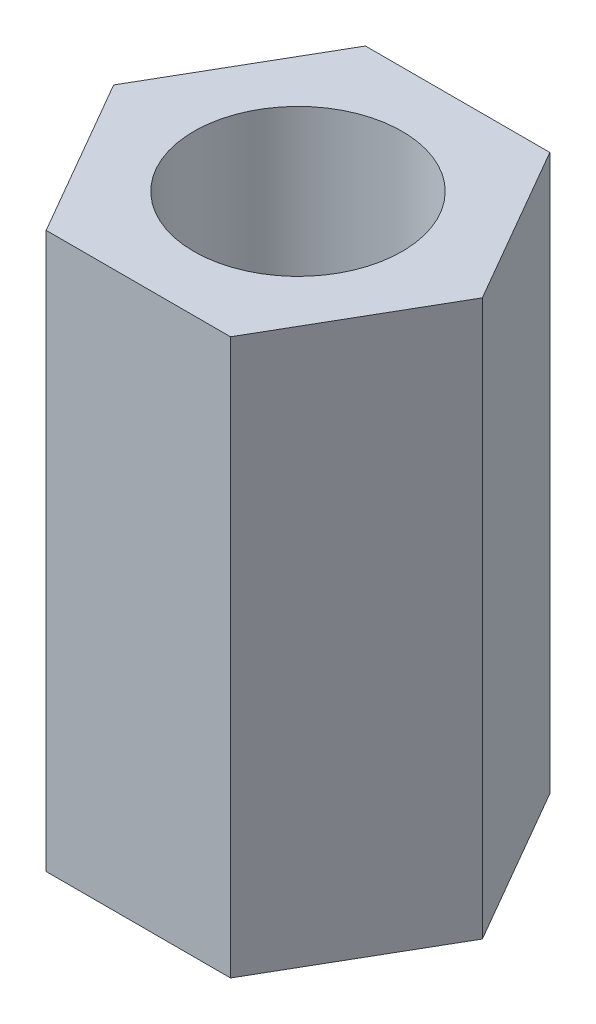
ISO-10303-21;
HEADER;
FILE_DESCRIPTION(('STEP AP214'),'2;1');
FILE_NAME('part.step','',(''),(''),'','','');
FILE_SCHEMA(('AUTOMOTIVE_DESIGN { 1 0 10303 214 1 1 1 1 }'));
ENDSEC;
DATA;
#1=APPLICATION_CONTEXT('core data for automotive mechanical design processes');
#2=APPLICATION_PROTOCOL_DEFINITION('international standard','automotive_design',2000,#1);
#3=PRODUCT_CONTEXT('',#1,'mechanical');
#4=PRODUCT('Part','Part','',(#3));
#5=PRODUCT_RELATED_PRODUCT_CATEGORY('part','',(#4));
#6=PRODUCT_DEFINITION_FORMATION('','',#4);
#7=PRODUCT_DEFINITION_CONTEXT('part definition',#1,'design');
#8=PRODUCT_DEFINITION('design','',#6,#7);
#9=PRODUCT_DEFINITION_SHAPE('','',#8);
#10=(LENGTH_UNIT() NAMED_UNIT(*) SI_UNIT(.MILLI.,.METRE.));
#11=(NAMED_UNIT(*) PLANE_ANGLE_UNIT() SI_UNIT($,.RADIAN.));
#12=(NAMED_UNIT(*) SI_UNIT($,.STERADIAN.) SOLID_ANGLE_UNIT());
#13=UNCERTAINTY_MEASURE_WITH_UNIT(LENGTH_MEASURE(1.E-05),#10,'distance_accuracy_value','');
#14=(GEOMETRIC_REPRESENTATION_CONTEXT(3) GLOBAL_UNCERTAINTY_ASSIGNED_CONTEXT((#13)) GLOBAL_UNIT_ASSIGNED_CONTEXT((#10,
#11,#12)) REPRESENTATION_CONTEXT('',''));
#15=CARTESIAN_POINT('',(0.,0.,0.));
#16=DIRECTION('',(0.,0.,1.));
#17=DIRECTION('',(1.,0.,0.));
#18=AXIS2_PLACEMENT_3D('',#15,#16,#17);
#19=CARTESIAN_POINT('',(1.32790561913617,8.,2.29999999999999));
#20=DIRECTION('',(-0.866025403784441,0.,-0.499999999999995));
#21=DIRECTION('',(-0.499999999999995,0.,0.866025403784442));
#22=AXIS2_PLACEMENT_3D('',#19,#20,#21);
#23=PLANE('',#22);
#24=DIRECTION('',(0.499999999999995,0.,-0.866025403784442));
#25=VECTOR('',#24,1.);
#26=CARTESIAN_POINT('',(1.32790561913617,0.,2.29999999999999));
#27=LINE('',#26,#25);
#28=CARTESIAN_POINT('',(1.32790561913617,0.,2.29999999999999));
#29=VERTEX_POINT('',#28);
#30=CARTESIAN_POINT('',(2.65581123827228,0.,0.));
#31=VERTEX_POINT('',#30);
#32=EDGE_CURVE('E123',#29,#31,#27,.T.);
#33=ORIENTED_EDGE('',*,*,#32,.T.);
#34=DIRECTION('',(0.,-1.,0.));
#35=VECTOR('',#34,1.);
#36=CARTESIAN_POINT('',(2.65581123827228,8.,0.));
#37=LINE('',#36,#35);
#38=CARTESIAN_POINT('',(2.65581123827228,8.,0.));
#39=VERTEX_POINT('',#38);
#40=EDGE_CURVE('E11',#39,#31,#37,.T.);
#41=ORIENTED_EDGE('',*,*,#40,.F.);
#42=DIRECTION('',(0.499999999999995,0.,-0.866025403784442));
#43=VECTOR('',#42,1.);
#44=CARTESIAN_POINT('',(1.32790561913617,8.,2.29999999999999));
#45=LINE('',#44,#43);
#46=CARTESIAN_POINT('',(1.32790561913617,8.,2.29999999999999));
#47=VERTEX_POINT('',#46);
#48=EDGE_CURVE('E134',#47,#39,#45,.T.);
#49=ORIENTED_EDGE('',*,*,#48,.F.);
#50=DIRECTION('',(0.,-1.,0.));
#51=VECTOR('',#50,1.);
#52=CARTESIAN_POINT('',(1.32790561913617,8.,2.29999999999999));
#53=LINE('',#52,#51);
#54=EDGE_CURVE('E119',#47,#29,#53,.T.);
#55=ORIENTED_EDGE('',*,*,#54,.T.);
#56=EDGE_LOOP('',(#33,#41,#49,#55));
#57=FACE_BOUND('',#56,.T.);
#58=ADVANCED_FACE('F39',(#57),#23,.F.);
#59=CARTESIAN_POINT('',(2.65581123827228,8.,0.));
#60=DIRECTION('',(-0.866025403784438,0.,0.500000000000001));
#61=DIRECTION('',(0.500000000000001,0.,0.866025403784438));
#62=AXIS2_PLACEMENT_3D('',#59,#60,#61);
#63=PLANE('',#62);
#64=DIRECTION('',(-0.500000000000001,0.,-0.866025403784438));
#65=VECTOR('',#64,1.);
#66=CARTESIAN_POINT('',(2.65581123827228,0.,0.));
#67=LINE('',#66,#65);
#68=CARTESIAN_POINT('',(1.32790561913613,0.,-2.3));
#69=VERTEX_POINT('',#68);
#70=EDGE_CURVE('E126',#31,#69,#67,.T.);
#71=ORIENTED_EDGE('',*,*,#70,.T.);
#72=DIRECTION('',(0.,-1.,0.));
#73=VECTOR('',#72,1.);
#74=CARTESIAN_POINT('',(1.32790561913613,8.,-2.3));
#75=LINE('',#74,#73);
#76=CARTESIAN_POINT('',(1.32790561913613,8.,-2.3));
#77=VERTEX_POINT('',#76);
#78=EDGE_CURVE('E47',#77,#69,#75,.T.);
#79=ORIENTED_EDGE('',*,*,#78,.F.);
#80=DIRECTION('',(-0.500000000000001,0.,-0.866025403784438));
#81=VECTOR('',#80,1.);
#82=CARTESIAN_POINT('',(2.65581123827228,8.,0.));
#83=LINE('',#82,#81);
#84=EDGE_CURVE('E92',#39,#77,#83,.T.);
#85=ORIENTED_EDGE('',*,*,#84,.F.);
#86=ORIENTED_EDGE('',*,*,#40,.T.);
#87=EDGE_LOOP('',(#71,#79,#85,#86));
#88=FACE_BOUND('',#87,.T.);
#89=ADVANCED_FACE('F159',(#88),#63,.F.);
#90=CARTESIAN_POINT('',(1.32790561913613,8.,-2.3));
#91=DIRECTION('',(0.,0.,1.));
#92=DIRECTION('',(1.,0.,0.));
#93=AXIS2_PLACEMENT_3D('',#90,#91,#92);
#94=PLANE('',#93);
#95=DIRECTION('',(-1.,0.,0.));
#96=VECTOR('',#95,1.);
#97=CARTESIAN_POINT('',(1.32790561913613,0.,-2.3));
#98=LINE('',#97,#96);
#99=CARTESIAN_POINT('',(-1.32790561913615,0.,-2.3));
#100=VERTEX_POINT('',#99);
#101=EDGE_CURVE('E129',#69,#100,#98,.T.);
#102=ORIENTED_EDGE('',*,*,#101,.T.);
#103=DIRECTION('',(0.,-1.,0.));
#104=VECTOR('',#103,1.);
#105=CARTESIAN_POINT('',(-1.32790561913615,8.,-2.3));
#106=LINE('',#105,#104);
#107=CARTESIAN_POINT('',(-1.32790561913615,8.,-2.3));
#108=VERTEX_POINT('',#107);
#109=EDGE_CURVE('E114',#108,#100,#106,.T.);
#110=ORIENTED_EDGE('',*,*,#109,.F.);
#111=DIRECTION('',(-1.,0.,0.));
#112=VECTOR('',#111,1.);
#113=CARTESIAN_POINT('',(1.32790561913613,8.,-2.3));
#114=LINE('',#113,#112);
#115=EDGE_CURVE('E105',#77,#108,#114,.T.);
#116=ORIENTED_EDGE('',*,*,#115,.F.);
#117=ORIENTED_EDGE('',*,*,#78,.T.);
#118=EDGE_LOOP('',(#102,#110,#116,#117));
#119=FACE_BOUND('',#118,.T.);
#120=ADVANCED_FACE('F140',(#119),#94,.F.);
#121=CARTESIAN_POINT('',(-1.32790561913615,8.,-2.3));
#122=DIRECTION('',(0.866025403784442,0.,0.499999999999995));
#123=DIRECTION('',(0.499999999999995,0.,-0.866025403784442));
#124=AXIS2_PLACEMENT_3D('',#121,#122,#123);
#125=PLANE('',#124);
#126=DIRECTION('',(-0.499999999999995,0.,0.866025403784442));
#127=VECTOR('',#126,1.);
#128=CARTESIAN_POINT('',(-1.32790561913615,0.,-2.3));
#129=LINE('',#128,#127);
#130=CARTESIAN_POINT('',(-2.65581123827228,0.,0.));
#131=VERTEX_POINT('',#130);
#132=EDGE_CURVE('E113',#100,#131,#129,.T.);
#133=ORIENTED_EDGE('',*,*,#132,.T.);
#134=DIRECTION('',(0.,-1.,0.));
#135=VECTOR('',#134,1.);
#136=CARTESIAN_POINT('',(-2.65581123827228,8.,0.));
#137=LINE('',#136,#135);
#138=CARTESIAN_POINT('',(-2.65581123827228,8.,0.));
#139=VERTEX_POINT('',#138);
#140=EDGE_CURVE('E110',#139,#131,#137,.T.);
#141=ORIENTED_EDGE('',*,*,#140,.F.);
#142=DIRECTION('',(-0.499999999999995,0.,0.866025403784442));
#143=VECTOR('',#142,1.);
#144=CARTESIAN_POINT('',(-1.32790561913615,8.,-2.3));
#145=LINE('',#144,#143);
#146=EDGE_CURVE('E99',#108,#139,#145,.T.);
#147=ORIENTED_EDGE('',*,*,#146,.F.);
#148=ORIENTED_EDGE('',*,*,#109,.T.);
#149=EDGE_LOOP('',(#133,#141,#147,#148));
#150=FACE_BOUND('',#149,.T.);
#151=ADVANCED_FACE('F111',(#150),#125,.F.);
#152=CARTESIAN_POINT('',(-2.65581123827228,8.,0.));
#153=DIRECTION('',(0.866025403784434,0.,-0.500000000000007));
#154=DIRECTION('',(-0.500000000000007,0.,-0.866025403784434));
#155=AXIS2_PLACEMENT_3D('',#152,#153,#154);
#156=PLANE('',#155);
#157=DIRECTION('',(0.500000000000007,0.,0.866025403784434));
#158=VECTOR('',#157,1.);
#159=CARTESIAN_POINT('',(-2.65581123827228,0.,0.));
#160=LINE('',#159,#158);
#161=CARTESIAN_POINT('',(-1.32790561913612,0.,2.30000000000001));
#162=VERTEX_POINT('',#161);
#163=EDGE_CURVE('E78',#131,#162,#160,.T.);
#164=ORIENTED_EDGE('',*,*,#163,.T.);
#165=DIRECTION('',(0.,-1.,0.));
#166=VECTOR('',#165,1.);
#167=CARTESIAN_POINT('',(-1.32790561913612,8.,2.30000000000001));
#168=LINE('',#167,#166);
#169=CARTESIAN_POINT('',(-1.32790561913612,8.,2.30000000000001));
#170=VERTEX_POINT('',#169);
#171=EDGE_CURVE('E115',#170,#162,#168,.T.);
#172=ORIENTED_EDGE('',*,*,#171,.F.);
#173=DIRECTION('',(0.500000000000007,0.,0.866025403784434));
#174=VECTOR('',#173,1.);
#175=CARTESIAN_POINT('',(-2.65581123827228,8.,0.));
#176=LINE('',#175,#174);
#177=EDGE_CURVE('E103',#139,#170,#176,.T.);
#178=ORIENTED_EDGE('',*,*,#177,.F.);
#179=ORIENTED_EDGE('',*,*,#140,.T.);
#180=EDGE_LOOP('',(#164,#172,#178,#179));
#181=FACE_BOUND('',#180,.T.);
#182=ADVANCED_FACE('F117',(#181),#156,.F.);
#183=CARTESIAN_POINT('',(-1.32790561913612,8.,2.30000000000001));
#184=DIRECTION('',(0.,0.,-1.));
#185=DIRECTION('',(-1.,0.,0.));
#186=AXIS2_PLACEMENT_3D('',#183,#184,#185);
#187=PLANE('',#186);
#188=DIRECTION('',(1.,0.,0.));
#189=VECTOR('',#188,1.);
#190=CARTESIAN_POINT('',(-1.32790561913612,0.,2.30000000000001));
#191=LINE('',#190,#189);
#192=EDGE_CURVE('E84',#162,#29,#191,.T.);
#193=ORIENTED_EDGE('',*,*,#192,.T.);
#194=ORIENTED_EDGE('',*,*,#54,.F.);
#195=DIRECTION('',(1.,0.,0.));
#196=VECTOR('',#195,1.);
#197=CARTESIAN_POINT('',(-1.32790561913612,8.,2.30000000000001));
#198=LINE('',#197,#196);
#199=EDGE_CURVE('E55',#170,#47,#198,.T.);
#200=ORIENTED_EDGE('',*,*,#199,.F.);
#201=ORIENTED_EDGE('',*,*,#171,.T.);
#202=EDGE_LOOP('',(#193,#194,#200,#201));
#203=FACE_BOUND('',#202,.T.);
#204=ADVANCED_FACE('F147',(#203),#187,.F.);
#205=CARTESIAN_POINT('',(0.,8.,0.));
#206=DIRECTION('',(0.,1.,0.));
#207=DIRECTION('',(0.,0.,1.));
#208=AXIS2_PLACEMENT_3D('',#205,#206,#207);
#209=PLANE('',#208);
#210=CARTESIAN_POINT('',(0.,8.,0.));
#211=DIRECTION('',(0.,1.,0.));
#212=DIRECTION('',(0.,0.,1.));
#213=AXIS2_PLACEMENT_3D('',#210,#211,#212);
#214=CIRCLE('',#213,1.50000000000001);
#215=CARTESIAN_POINT('',(0.,8.,1.50000000000001));
#216=VERTEX_POINT('',#215);
#217=EDGE_CURVE('E215',#216,#216,#214,.T.);
#218=ORIENTED_EDGE('',*,*,#217,.F.);
#219=EDGE_LOOP('',(#218));
#220=FACE_BOUND('',#219,.T.);
#221=ORIENTED_EDGE('',*,*,#48,.T.);
#222=ORIENTED_EDGE('',*,*,#84,.T.);
#223=ORIENTED_EDGE('',*,*,#115,.T.);
#224=ORIENTED_EDGE('',*,*,#146,.T.);
#225=ORIENTED_EDGE('',*,*,#177,.T.);
#226=ORIENTED_EDGE('',*,*,#199,.T.);
#227=EDGE_LOOP('',(#221,#222,#223,#224,#225,#226));
#228=FACE_BOUND('',#227,.T.);
#229=ADVANCED_FACE('F101',(#220,#228),#209,.T.);
#230=CARTESIAN_POINT('',(0.,0.,0.));
#231=DIRECTION('',(0.,1.,0.));
#232=DIRECTION('',(0.,0.,1.));
#233=AXIS2_PLACEMENT_3D('',#230,#231,#232);
#234=PLANE('',#233);
#235=CARTESIAN_POINT('',(0.,0.,0.));
#236=DIRECTION('',(0.,1.,0.));
#237=DIRECTION('',(0.,0.,1.));
#238=AXIS2_PLACEMENT_3D('',#235,#236,#237);
#239=CIRCLE('',#238,1.50000000000001);
#240=CARTESIAN_POINT('',(0.,0.,1.50000000000001));
#241=VERTEX_POINT('',#240);
#242=EDGE_CURVE('E127',#241,#241,#239,.T.);
#243=ORIENTED_EDGE('',*,*,#242,.T.);
#244=EDGE_LOOP('',(#243));
#245=FACE_BOUND('',#244,.T.);
#246=ORIENTED_EDGE('',*,*,#32,.F.);
#247=ORIENTED_EDGE('',*,*,#192,.F.);
#248=ORIENTED_EDGE('',*,*,#163,.F.);
#249=ORIENTED_EDGE('',*,*,#132,.F.);
#250=ORIENTED_EDGE('',*,*,#101,.F.);
#251=ORIENTED_EDGE('',*,*,#70,.F.);
#252=EDGE_LOOP('',(#246,#247,#248,#249,#250,#251));
#253=FACE_BOUND('',#252,.T.);
#254=ADVANCED_FACE('F143',(#245,#253),#234,.F.);
#255=CARTESIAN_POINT('',(0.,8.,0.));
#256=DIRECTION('',(0.,1.,0.));
#257=DIRECTION('',(0.,0.,1.));
#258=AXIS2_PLACEMENT_3D('',#255,#256,#257);
#259=CYLINDRICAL_SURFACE('',#258,1.50000000000001);
#260=ORIENTED_EDGE('',*,*,#242,.F.);
#261=EDGE_LOOP('',(#260));
#262=FACE_BOUND('',#261,.T.);
#263=ORIENTED_EDGE('',*,*,#217,.T.);
#264=EDGE_LOOP('',(#263));
#265=FACE_BOUND('',#264,.T.);
#266=ADVANCED_FACE('F198',(#262,#265),#259,.F.);
#267=CLOSED_SHELL('',(#58,#89,#120,#151,#182,#204,#229,#254,#266));
#268=MANIFOLD_SOLID_BREP('B2',#267);
#269=ADVANCED_BREP_SHAPE_REPRESENTATION('',(#18,#268),#14);
#270=SHAPE_DEFINITION_REPRESENTATION(#9,#269);
ENDSEC;
END-ISO-10303-21;
